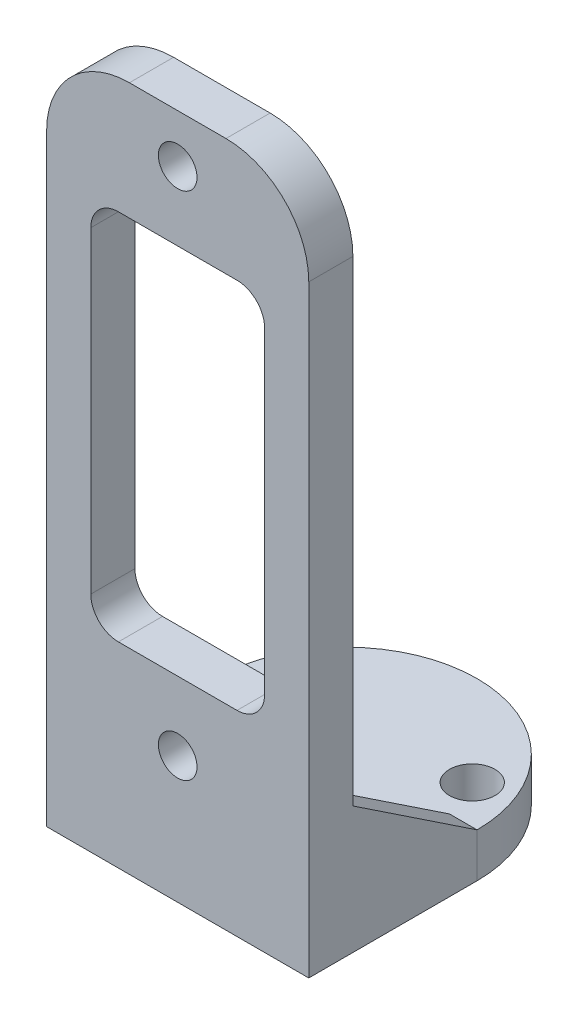
ISO-10303-21;
HEADER;
FILE_DESCRIPTION(('STEP AP214'),'2;1');
FILE_NAME('part.step','',(''),(''),'','','');
FILE_SCHEMA(('AUTOMOTIVE_DESIGN { 1 0 10303 214 1 1 1 1 }'));
ENDSEC;
DATA;
#1=APPLICATION_CONTEXT('core data for automotive mechanical design processes');
#2=APPLICATION_PROTOCOL_DEFINITION('international standard','automotive_design',2000,#1);
#3=PRODUCT_CONTEXT('',#1,'mechanical');
#4=PRODUCT('Part','Part','',(#3));
#5=PRODUCT_RELATED_PRODUCT_CATEGORY('part','',(#4));
#6=PRODUCT_DEFINITION_FORMATION('','',#4);
#7=PRODUCT_DEFINITION_CONTEXT('part definition',#1,'design');
#8=PRODUCT_DEFINITION('design','',#6,#7);
#9=PRODUCT_DEFINITION_SHAPE('','',#8);
#10=(LENGTH_UNIT() NAMED_UNIT(*) SI_UNIT(.MILLI.,.METRE.));
#11=(NAMED_UNIT(*) PLANE_ANGLE_UNIT() SI_UNIT($,.RADIAN.));
#12=(NAMED_UNIT(*) SI_UNIT($,.STERADIAN.) SOLID_ANGLE_UNIT());
#13=UNCERTAINTY_MEASURE_WITH_UNIT(LENGTH_MEASURE(1.E-05),#10,'distance_accuracy_value','');
#14=(GEOMETRIC_REPRESENTATION_CONTEXT(3) GLOBAL_UNCERTAINTY_ASSIGNED_CONTEXT((#13)) GLOBAL_UNIT_ASSIGNED_CONTEXT((#10,
#11,#12)) REPRESENTATION_CONTEXT('',''));
#15=CARTESIAN_POINT('',(0.,0.,0.));
#16=DIRECTION('',(0.,0.,1.));
#17=DIRECTION('',(1.,0.,0.));
#18=AXIS2_PLACEMENT_3D('',#15,#16,#17);
#19=CARTESIAN_POINT('',(6.,40.5,0.));
#20=DIRECTION('',(0.,0.,-1.));
#21=DIRECTION('',(-1.,0.,0.));
#22=AXIS2_PLACEMENT_3D('',#19,#20,#21);
#23=PLANE('',#22);
#24=CARTESIAN_POINT('',(9.5,6.,0.));
#25=DIRECTION('',(0.,0.,1.));
#26=DIRECTION('',(1.,0.,0.));
#27=AXIS2_PLACEMENT_3D('',#24,#25,#26);
#28=CIRCLE('',#27,1.4);
#29=CARTESIAN_POINT('',(10.9,6.,0.));
#30=VERTEX_POINT('',#29);
#31=EDGE_CURVE('E292',#30,#30,#28,.T.);
#32=ORIENTED_EDGE('',*,*,#31,.T.);
#33=EDGE_LOOP('',(#32));
#34=FACE_BOUND('',#33,.T.);
#35=CARTESIAN_POINT('',(9.5,43.,0.));
#36=DIRECTION('',(0.,0.,1.));
#37=DIRECTION('',(1.,0.,0.));
#38=AXIS2_PLACEMENT_3D('',#35,#36,#37);
#39=CIRCLE('',#38,1.4);
#40=CARTESIAN_POINT('',(10.9,43.,0.));
#41=VERTEX_POINT('',#40);
#42=EDGE_CURVE('E287',#41,#41,#39,.T.);
#43=ORIENTED_EDGE('',*,*,#42,.T.);
#44=EDGE_LOOP('',(#43));
#45=FACE_BOUND('',#44,.T.);
#46=DIRECTION('',(0.,1.,0.));
#47=VECTOR('',#46,1.);
#48=CARTESIAN_POINT('',(19.,0.,0.));
#49=LINE('',#48,#47);
#50=CARTESIAN_POINT('',(19.,6.,0.));
#51=VERTEX_POINT('',#50);
#52=CARTESIAN_POINT('',(19.,40.5,0.));
#53=VERTEX_POINT('',#52);
#54=EDGE_CURVE('E39',#51,#53,#49,.T.);
#55=ORIENTED_EDGE('',*,*,#54,.F.);
#56=DIRECTION('',(-1.,0.,0.));
#57=VECTOR('',#56,1.);
#58=CARTESIAN_POINT('',(19.,6.,0.));
#59=LINE('',#58,#57);
#60=CARTESIAN_POINT('',(17.,6.,0.));
#61=VERTEX_POINT('',#60);
#62=EDGE_CURVE('E240',#51,#61,#59,.T.);
#63=ORIENTED_EDGE('',*,*,#62,.T.);
#64=DIRECTION('',(0.,-1.,0.));
#65=VECTOR('',#64,1.);
#66=CARTESIAN_POINT('',(17.,6.,0.));
#67=LINE('',#66,#65);
#68=CARTESIAN_POINT('',(17.,0.,0.));
#69=VERTEX_POINT('',#68);
#70=EDGE_CURVE('E185',#61,#69,#67,.T.);
#71=ORIENTED_EDGE('',*,*,#70,.T.);
#72=DIRECTION('',(1.,0.,0.));
#73=VECTOR('',#72,1.);
#74=CARTESIAN_POINT('',(0.,0.,0.));
#75=LINE('',#74,#73);
#76=CARTESIAN_POINT('',(2.,0.,0.));
#77=VERTEX_POINT('',#76);
#78=EDGE_CURVE('E317',#77,#69,#75,.T.);
#79=ORIENTED_EDGE('',*,*,#78,.F.);
#80=DIRECTION('',(0.,-1.,0.));
#81=VECTOR('',#80,1.);
#82=CARTESIAN_POINT('',(2.,6.,0.));
#83=LINE('',#82,#81);
#84=CARTESIAN_POINT('',(2.,6.,0.));
#85=VERTEX_POINT('',#84);
#86=EDGE_CURVE('E252',#85,#77,#83,.T.);
#87=ORIENTED_EDGE('',*,*,#86,.F.);
#88=DIRECTION('',(-1.,0.,0.));
#89=VECTOR('',#88,1.);
#90=CARTESIAN_POINT('',(2.,6.,0.));
#91=LINE('',#90,#89);
#92=CARTESIAN_POINT('',(0.,6.,0.));
#93=VERTEX_POINT('',#92);
#94=EDGE_CURVE('E261',#85,#93,#91,.T.);
#95=ORIENTED_EDGE('',*,*,#94,.T.);
#96=DIRECTION('',(0.,-1.,0.));
#97=VECTOR('',#96,1.);
#98=CARTESIAN_POINT('',(0.,0.,0.));
#99=LINE('',#98,#97);
#100=CARTESIAN_POINT('',(0.,40.5,0.));
#101=VERTEX_POINT('',#100);
#102=EDGE_CURVE('E298',#101,#93,#99,.T.);
#103=ORIENTED_EDGE('',*,*,#102,.F.);
#104=CARTESIAN_POINT('',(6.,40.5,0.));
#105=DIRECTION('',(0.,0.,1.));
#106=DIRECTION('',(-1.,0.,0.));
#107=AXIS2_PLACEMENT_3D('',#104,#105,#106);
#108=CIRCLE('',#107,6.);
#109=CARTESIAN_POINT('',(6.,46.5,0.));
#110=VERTEX_POINT('',#109);
#111=EDGE_CURVE('E304',#110,#101,#108,.T.);
#112=ORIENTED_EDGE('',*,*,#111,.F.);
#113=DIRECTION('',(-1.,0.,0.));
#114=VECTOR('',#113,1.);
#115=CARTESIAN_POINT('',(6.,46.5,0.));
#116=LINE('',#115,#114);
#117=CARTESIAN_POINT('',(13.,46.5,0.));
#118=VERTEX_POINT('',#117);
#119=EDGE_CURVE('E332',#118,#110,#116,.T.);
#120=ORIENTED_EDGE('',*,*,#119,.F.);
#121=CARTESIAN_POINT('',(13.,40.5,0.));
#122=DIRECTION('',(0.,0.,1.));
#123=DIRECTION('',(-1.,0.,0.));
#124=AXIS2_PLACEMENT_3D('',#121,#122,#123);
#125=CIRCLE('',#124,6.);
#126=EDGE_CURVE('E315',#53,#118,#125,.T.);
#127=ORIENTED_EDGE('',*,*,#126,.F.);
#128=EDGE_LOOP('',(#55,#63,#71,#79,#87,#95,#103,#112,#120,#127));
#129=FACE_BOUND('',#128,.T.);
#130=DIRECTION('',(0.,-1.,0.));
#131=VECTOR('',#130,1.);
#132=CARTESIAN_POINT('',(3.2,36.,0.));
#133=LINE('',#132,#131);
#134=CARTESIAN_POINT('',(3.2,36.,0.));
#135=VERTEX_POINT('',#134);
#136=CARTESIAN_POINT('',(3.2,13.,0.));
#137=VERTEX_POINT('',#136);
#138=EDGE_CURVE('E178',#135,#137,#133,.T.);
#139=ORIENTED_EDGE('',*,*,#138,.T.);
#140=CARTESIAN_POINT('',(5.2,13.,0.));
#141=DIRECTION('',(0.,0.,1.));
#142=DIRECTION('',(1.,0.,0.));
#143=AXIS2_PLACEMENT_3D('',#140,#141,#142);
#144=CIRCLE('',#143,2.);
#145=CARTESIAN_POINT('',(5.2,11.,0.));
#146=VERTEX_POINT('',#145);
#147=EDGE_CURVE('E53',#137,#146,#144,.T.);
#148=ORIENTED_EDGE('',*,*,#147,.T.);
#149=DIRECTION('',(1.,0.,0.));
#150=VECTOR('',#149,1.);
#151=CARTESIAN_POINT('',(5.2,11.,0.));
#152=LINE('',#151,#150);
#153=CARTESIAN_POINT('',(13.8,11.,0.));
#154=VERTEX_POINT('',#153);
#155=EDGE_CURVE('E184',#146,#154,#152,.T.);
#156=ORIENTED_EDGE('',*,*,#155,.T.);
#157=CARTESIAN_POINT('',(13.8,13.,0.));
#158=DIRECTION('',(0.,0.,1.));
#159=DIRECTION('',(1.,0.,0.));
#160=AXIS2_PLACEMENT_3D('',#157,#158,#159);
#161=CIRCLE('',#160,2.);
#162=CARTESIAN_POINT('',(15.8,13.,0.));
#163=VERTEX_POINT('',#162);
#164=EDGE_CURVE('E209',#154,#163,#161,.T.);
#165=ORIENTED_EDGE('',*,*,#164,.T.);
#166=DIRECTION('',(0.,1.,0.));
#167=VECTOR('',#166,1.);
#168=CARTESIAN_POINT('',(15.8,36.,0.));
#169=LINE('',#168,#167);
#170=CARTESIAN_POINT('',(15.8,36.,0.));
#171=VERTEX_POINT('',#170);
#172=EDGE_CURVE('E212',#163,#171,#169,.T.);
#173=ORIENTED_EDGE('',*,*,#172,.T.);
#174=CARTESIAN_POINT('',(13.8,36.,0.));
#175=DIRECTION('',(0.,0.,1.));
#176=DIRECTION('',(-1.,0.,0.));
#177=AXIS2_PLACEMENT_3D('',#174,#175,#176);
#178=CIRCLE('',#177,2.);
#179=CARTESIAN_POINT('',(13.8,38.,0.));
#180=VERTEX_POINT('',#179);
#181=EDGE_CURVE('E215',#171,#180,#178,.T.);
#182=ORIENTED_EDGE('',*,*,#181,.T.);
#183=DIRECTION('',(-1.,0.,0.));
#184=VECTOR('',#183,1.);
#185=CARTESIAN_POINT('',(5.2,38.,0.));
#186=LINE('',#185,#184);
#187=CARTESIAN_POINT('',(5.2,38.,0.));
#188=VERTEX_POINT('',#187);
#189=EDGE_CURVE('E218',#180,#188,#186,.T.);
#190=ORIENTED_EDGE('',*,*,#189,.T.);
#191=CARTESIAN_POINT('',(5.2,36.,0.));
#192=DIRECTION('',(0.,0.,1.));
#193=DIRECTION('',(1.,0.,0.));
#194=AXIS2_PLACEMENT_3D('',#191,#192,#193);
#195=CIRCLE('',#194,2.);
#196=EDGE_CURVE('E221',#188,#135,#195,.T.);
#197=ORIENTED_EDGE('',*,*,#196,.T.);
#198=EDGE_LOOP('',(#139,#148,#156,#165,#173,#182,#190,#197));
#199=FACE_BOUND('',#198,.T.);
#200=ADVANCED_FACE('F35',(#34,#45,#129,#199),#23,.T.);
#201=CARTESIAN_POINT('',(6.,40.5,3.2));
#202=DIRECTION('',(0.,0.,-1.));
#203=DIRECTION('',(-1.,0.,0.));
#204=AXIS2_PLACEMENT_3D('',#201,#202,#203);
#205=PLANE('',#204);
#206=CARTESIAN_POINT('',(9.5,43.,3.2));
#207=DIRECTION('',(0.,0.,1.));
#208=DIRECTION('',(1.,0.,0.));
#209=AXIS2_PLACEMENT_3D('',#206,#207,#208);
#210=CIRCLE('',#209,1.4);
#211=CARTESIAN_POINT('',(10.9,43.,3.2));
#212=VERTEX_POINT('',#211);
#213=EDGE_CURVE('E289',#212,#212,#210,.T.);
#214=ORIENTED_EDGE('',*,*,#213,.F.);
#215=EDGE_LOOP('',(#214));
#216=FACE_BOUND('',#215,.T.);
#217=CARTESIAN_POINT('',(9.5,6.,3.2));
#218=DIRECTION('',(0.,0.,1.));
#219=DIRECTION('',(1.,0.,0.));
#220=AXIS2_PLACEMENT_3D('',#217,#218,#219);
#221=CIRCLE('',#220,1.4);
#222=CARTESIAN_POINT('',(10.9,6.,3.2));
#223=VERTEX_POINT('',#222);
#224=EDGE_CURVE('E295',#223,#223,#221,.T.);
#225=ORIENTED_EDGE('',*,*,#224,.F.);
#226=EDGE_LOOP('',(#225));
#227=FACE_BOUND('',#226,.T.);
#228=DIRECTION('',(0.,-1.,0.));
#229=VECTOR('',#228,1.);
#230=CARTESIAN_POINT('',(0.,0.,3.2));
#231=LINE('',#230,#229);
#232=CARTESIAN_POINT('',(0.,40.5,3.2));
#233=VERTEX_POINT('',#232);
#234=CARTESIAN_POINT('',(0.,-3.2,3.2));
#235=VERTEX_POINT('',#234);
#236=EDGE_CURVE('E301',#233,#235,#231,.T.);
#237=ORIENTED_EDGE('',*,*,#236,.T.);
#238=DIRECTION('',(1.,0.,0.));
#239=VECTOR('',#238,1.);
#240=CARTESIAN_POINT('',(0.,-3.2,3.2));
#241=LINE('',#240,#239);
#242=CARTESIAN_POINT('',(19.,-3.2,3.2));
#243=VERTEX_POINT('',#242);
#244=EDGE_CURVE('E275',#235,#243,#241,.T.);
#245=ORIENTED_EDGE('',*,*,#244,.T.);
#246=DIRECTION('',(0.,1.,0.));
#247=VECTOR('',#246,1.);
#248=CARTESIAN_POINT('',(19.,0.,3.2));
#249=LINE('',#248,#247);
#250=CARTESIAN_POINT('',(19.,40.5,3.2));
#251=VERTEX_POINT('',#250);
#252=EDGE_CURVE('E303',#243,#251,#249,.T.);
#253=ORIENTED_EDGE('',*,*,#252,.T.);
#254=CARTESIAN_POINT('',(13.,40.5,3.2));
#255=DIRECTION('',(0.,0.,1.));
#256=DIRECTION('',(-1.,0.,0.));
#257=AXIS2_PLACEMENT_3D('',#254,#255,#256);
#258=CIRCLE('',#257,6.);
#259=CARTESIAN_POINT('',(13.,46.5,3.2));
#260=VERTEX_POINT('',#259);
#261=EDGE_CURVE('E306',#251,#260,#258,.T.);
#262=ORIENTED_EDGE('',*,*,#261,.T.);
#263=DIRECTION('',(-1.,0.,0.));
#264=VECTOR('',#263,1.);
#265=CARTESIAN_POINT('',(6.,46.5,3.2));
#266=LINE('',#265,#264);
#267=CARTESIAN_POINT('',(6.,46.5,3.2));
#268=VERTEX_POINT('',#267);
#269=EDGE_CURVE('E308',#260,#268,#266,.T.);
#270=ORIENTED_EDGE('',*,*,#269,.T.);
#271=CARTESIAN_POINT('',(6.,40.5,3.2));
#272=DIRECTION('',(0.,0.,1.));
#273=DIRECTION('',(-1.,0.,0.));
#274=AXIS2_PLACEMENT_3D('',#271,#272,#273);
#275=CIRCLE('',#274,6.);
#276=EDGE_CURVE('E310',#268,#233,#275,.T.);
#277=ORIENTED_EDGE('',*,*,#276,.T.);
#278=EDGE_LOOP('',(#237,#245,#253,#262,#270,#277));
#279=FACE_BOUND('',#278,.T.);
#280=CARTESIAN_POINT('',(5.2,13.,3.2));
#281=DIRECTION('',(0.,0.,1.));
#282=DIRECTION('',(1.,0.,0.));
#283=AXIS2_PLACEMENT_3D('',#280,#281,#282);
#284=CIRCLE('',#283,2.);
#285=CARTESIAN_POINT('',(3.2,13.,3.2));
#286=VERTEX_POINT('',#285);
#287=CARTESIAN_POINT('',(5.2,11.,3.2));
#288=VERTEX_POINT('',#287);
#289=EDGE_CURVE('E169',#286,#288,#284,.T.);
#290=ORIENTED_EDGE('',*,*,#289,.F.);
#291=DIRECTION('',(0.,-1.,0.));
#292=VECTOR('',#291,1.);
#293=CARTESIAN_POINT('',(3.2,36.,3.2));
#294=LINE('',#293,#292);
#295=CARTESIAN_POINT('',(3.2,36.,3.2));
#296=VERTEX_POINT('',#295);
#297=EDGE_CURVE('E204',#296,#286,#294,.T.);
#298=ORIENTED_EDGE('',*,*,#297,.F.);
#299=CARTESIAN_POINT('',(5.2,36.,3.2));
#300=DIRECTION('',(0.,0.,1.));
#301=DIRECTION('',(1.,0.,0.));
#302=AXIS2_PLACEMENT_3D('',#299,#300,#301);
#303=CIRCLE('',#302,2.);
#304=CARTESIAN_POINT('',(5.2,38.,3.2));
#305=VERTEX_POINT('',#304);
#306=EDGE_CURVE('E202',#305,#296,#303,.T.);
#307=ORIENTED_EDGE('',*,*,#306,.F.);
#308=DIRECTION('',(-1.,0.,0.));
#309=VECTOR('',#308,1.);
#310=CARTESIAN_POINT('',(5.2,38.,3.2));
#311=LINE('',#310,#309);
#312=CARTESIAN_POINT('',(13.8,38.,3.2));
#313=VERTEX_POINT('',#312);
#314=EDGE_CURVE('E200',#313,#305,#311,.T.);
#315=ORIENTED_EDGE('',*,*,#314,.F.);
#316=CARTESIAN_POINT('',(13.8,36.,3.2));
#317=DIRECTION('',(0.,0.,1.));
#318=DIRECTION('',(-1.,0.,0.));
#319=AXIS2_PLACEMENT_3D('',#316,#317,#318);
#320=CIRCLE('',#319,2.);
#321=CARTESIAN_POINT('',(15.8,36.,3.2));
#322=VERTEX_POINT('',#321);
#323=EDGE_CURVE('E198',#322,#313,#320,.T.);
#324=ORIENTED_EDGE('',*,*,#323,.F.);
#325=DIRECTION('',(0.,1.,0.));
#326=VECTOR('',#325,1.);
#327=CARTESIAN_POINT('',(15.8,36.,3.2));
#328=LINE('',#327,#326);
#329=CARTESIAN_POINT('',(15.8,13.,3.2));
#330=VERTEX_POINT('',#329);
#331=EDGE_CURVE('E193',#330,#322,#328,.T.);
#332=ORIENTED_EDGE('',*,*,#331,.F.);
#333=CARTESIAN_POINT('',(13.8,13.,3.2));
#334=DIRECTION('',(0.,0.,1.));
#335=DIRECTION('',(1.,0.,0.));
#336=AXIS2_PLACEMENT_3D('',#333,#334,#335);
#337=CIRCLE('',#336,2.);
#338=CARTESIAN_POINT('',(13.8,11.,3.2));
#339=VERTEX_POINT('',#338);
#340=EDGE_CURVE('E191',#339,#330,#337,.T.);
#341=ORIENTED_EDGE('',*,*,#340,.F.);
#342=DIRECTION('',(1.,0.,0.));
#343=VECTOR('',#342,1.);
#344=CARTESIAN_POINT('',(5.2,11.,3.2));
#345=LINE('',#344,#343);
#346=EDGE_CURVE('E177',#288,#339,#345,.T.);
#347=ORIENTED_EDGE('',*,*,#346,.F.);
#348=EDGE_LOOP('',(#290,#298,#307,#315,#324,#332,#341,#347));
#349=FACE_BOUND('',#348,.T.);
#350=ADVANCED_FACE('F189',(#216,#227,#279,#349),#205,.F.);
#351=CARTESIAN_POINT('',(9.5,0.,-9.));
#352=DIRECTION('',(0.,1.,0.));
#353=DIRECTION('',(0.,0.,1.));
#354=AXIS2_PLACEMENT_3D('',#351,#352,#353);
#355=PLANE('',#354);
#356=CARTESIAN_POINT('',(15.85,0.,-11.8));
#357=DIRECTION('',(0.,1.,0.));
#358=DIRECTION('',(0.,0.,1.));
#359=AXIS2_PLACEMENT_3D('',#356,#357,#358);
#360=CIRCLE('',#359,1.65);
#361=CARTESIAN_POINT('',(15.85,0.,-10.15));
#362=VERTEX_POINT('',#361);
#363=EDGE_CURVE('E467',#362,#362,#360,.T.);
#364=ORIENTED_EDGE('',*,*,#363,.F.);
#365=EDGE_LOOP('',(#364));
#366=FACE_BOUND('',#365,.T.);
#367=CARTESIAN_POINT('',(14.14852263,0.,-5.45));
#368=DIRECTION('',(0.,1.,0.));
#369=DIRECTION('',(0.,0.,1.));
#370=AXIS2_PLACEMENT_3D('',#367,#368,#369);
#371=CIRCLE('',#370,1.65000000000001);
#372=CARTESIAN_POINT('',(14.14852263,0.,-3.79999999999999));
#373=VERTEX_POINT('',#372);
#374=EDGE_CURVE('E475',#373,#373,#371,.T.);
#375=ORIENTED_EDGE('',*,*,#374,.F.);
#376=EDGE_LOOP('',(#375));
#377=FACE_BOUND('',#376,.T.);
#378=CARTESIAN_POINT('',(4.85147737000001,0.,-5.45));
#379=DIRECTION('',(0.,1.,0.));
#380=DIRECTION('',(0.,0.,1.));
#381=AXIS2_PLACEMENT_3D('',#378,#379,#380);
#382=CIRCLE('',#381,1.65);
#383=CARTESIAN_POINT('',(4.85147737000001,0.,-3.8));
#384=VERTEX_POINT('',#383);
#385=EDGE_CURVE('E471',#384,#384,#382,.T.);
#386=ORIENTED_EDGE('',*,*,#385,.F.);
#387=EDGE_LOOP('',(#386));
#388=FACE_BOUND('',#387,.T.);
#389=CARTESIAN_POINT('',(3.15,0.,-11.8));
#390=DIRECTION('',(0.,1.,0.));
#391=DIRECTION('',(0.,0.,1.));
#392=AXIS2_PLACEMENT_3D('',#389,#390,#391);
#393=CIRCLE('',#392,1.65);
#394=CARTESIAN_POINT('',(3.15,0.,-10.15));
#395=VERTEX_POINT('',#394);
#396=EDGE_CURVE('E207',#395,#395,#393,.T.);
#397=ORIENTED_EDGE('',*,*,#396,.F.);
#398=EDGE_LOOP('',(#397));
#399=FACE_BOUND('',#398,.T.);
#400=DIRECTION('',(0.,0.,-1.));
#401=VECTOR('',#400,1.);
#402=CARTESIAN_POINT('',(17.,0.,0.));
#403=LINE('',#402,#401);
#404=CARTESIAN_POINT('',(17.,0.,-9.));
#405=VERTEX_POINT('',#404);
#406=EDGE_CURVE('E243',#69,#405,#403,.T.);
#407=ORIENTED_EDGE('',*,*,#406,.T.);
#408=DIRECTION('',(-1.,0.,0.));
#409=VECTOR('',#408,1.);
#410=CARTESIAN_POINT('',(19.,0.,-9.));
#411=LINE('',#410,#409);
#412=CARTESIAN_POINT('',(19.,0.,-9.));
#413=VERTEX_POINT('',#412);
#414=EDGE_CURVE('E248',#413,#405,#411,.T.);
#415=ORIENTED_EDGE('',*,*,#414,.F.);
#416=CARTESIAN_POINT('',(9.5,0.,-9.));
#417=DIRECTION('',(0.,1.,0.));
#418=DIRECTION('',(0.,0.,1.));
#419=AXIS2_PLACEMENT_3D('',#416,#417,#418);
#420=CIRCLE('',#419,9.5);
#421=CARTESIAN_POINT('',(0.,0.,-9.));
#422=VERTEX_POINT('',#421);
#423=EDGE_CURVE('E268',#413,#422,#420,.T.);
#424=ORIENTED_EDGE('',*,*,#423,.T.);
#425=DIRECTION('',(-1.,0.,0.));
#426=VECTOR('',#425,1.);
#427=CARTESIAN_POINT('',(2.,0.,-9.));
#428=LINE('',#427,#426);
#429=CARTESIAN_POINT('',(2.,0.,-9.));
#430=VERTEX_POINT('',#429);
#431=EDGE_CURVE('E265',#430,#422,#428,.T.);
#432=ORIENTED_EDGE('',*,*,#431,.F.);
#433=DIRECTION('',(0.,0.,-1.));
#434=VECTOR('',#433,1.);
#435=CARTESIAN_POINT('',(2.,0.,0.));
#436=LINE('',#435,#434);
#437=EDGE_CURVE('E255',#77,#430,#436,.T.);
#438=ORIENTED_EDGE('',*,*,#437,.F.);
#439=ORIENTED_EDGE('',*,*,#78,.T.);
#440=EDGE_LOOP('',(#407,#415,#424,#432,#438,#439));
#441=FACE_BOUND('',#440,.T.);
#442=ADVANCED_FACE('F382',(#366,#377,#388,#399,#441),#355,.T.);
#443=CARTESIAN_POINT('',(0.,0.,3.2));
#444=DIRECTION('',(1.,0.,0.));
#445=DIRECTION('',(0.,0.,-1.));
#446=AXIS2_PLACEMENT_3D('',#443,#444,#445);
#447=PLANE('',#446);
#448=ORIENTED_EDGE('',*,*,#102,.T.);
#449=DIRECTION('',(0.,0.554700196225229,0.832050294337844));
#450=VECTOR('',#449,1.);
#451=CARTESIAN_POINT('',(0.,0.,-9.));
#452=LINE('',#451,#450);
#453=EDGE_CURVE('E251',#422,#93,#452,.T.);
#454=ORIENTED_EDGE('',*,*,#453,.F.);
#455=DIRECTION('',(0.,1.,0.));
#456=VECTOR('',#455,1.);
#457=CARTESIAN_POINT('',(0.,-3.2,-9.));
#458=LINE('',#457,#456);
#459=CARTESIAN_POINT('',(0.,-3.2,-9.));
#460=VERTEX_POINT('',#459);
#461=EDGE_CURVE('E281',#460,#422,#458,.T.);
#462=ORIENTED_EDGE('',*,*,#461,.F.);
#463=DIRECTION('',(0.,0.,1.));
#464=VECTOR('',#463,1.);
#465=CARTESIAN_POINT('',(0.,-3.2,-9.));
#466=LINE('',#465,#464);
#467=EDGE_CURVE('E272',#460,#235,#466,.T.);
#468=ORIENTED_EDGE('',*,*,#467,.T.);
#469=ORIENTED_EDGE('',*,*,#236,.F.);
#470=DIRECTION('',(0.,0.,-1.));
#471=VECTOR('',#470,1.);
#472=CARTESIAN_POINT('',(0.,40.5,3.2));
#473=LINE('',#472,#471);
#474=EDGE_CURVE('E312',#233,#101,#473,.T.);
#475=ORIENTED_EDGE('',*,*,#474,.T.);
#476=EDGE_LOOP('',(#448,#454,#462,#468,#469,#475));
#477=FACE_BOUND('',#476,.T.);
#478=ADVANCED_FACE('F37',(#477),#447,.F.);
#479=CARTESIAN_POINT('',(19.,0.,3.2));
#480=DIRECTION('',(-1.,0.,0.));
#481=DIRECTION('',(0.,0.,1.));
#482=AXIS2_PLACEMENT_3D('',#479,#480,#481);
#483=PLANE('',#482);
#484=DIRECTION('',(0.,0.554700196225229,0.832050294337844));
#485=VECTOR('',#484,1.);
#486=CARTESIAN_POINT('',(19.,0.,-9.));
#487=LINE('',#486,#485);
#488=EDGE_CURVE('E237',#413,#51,#487,.T.);
#489=ORIENTED_EDGE('',*,*,#488,.T.);
#490=ORIENTED_EDGE('',*,*,#54,.T.);
#491=DIRECTION('',(0.,0.,-1.));
#492=VECTOR('',#491,1.);
#493=CARTESIAN_POINT('',(19.,40.5,3.2));
#494=LINE('',#493,#492);
#495=EDGE_CURVE('E11',#251,#53,#494,.T.);
#496=ORIENTED_EDGE('',*,*,#495,.F.);
#497=ORIENTED_EDGE('',*,*,#252,.F.);
#498=DIRECTION('',(0.,0.,-1.));
#499=VECTOR('',#498,1.);
#500=CARTESIAN_POINT('',(19.,-3.2,3.2));
#501=LINE('',#500,#499);
#502=CARTESIAN_POINT('',(19.,-3.2,-9.));
#503=VERTEX_POINT('',#502);
#504=EDGE_CURVE('E278',#243,#503,#501,.T.);
#505=ORIENTED_EDGE('',*,*,#504,.T.);
#506=DIRECTION('',(0.,1.,0.));
#507=VECTOR('',#506,1.);
#508=CARTESIAN_POINT('',(19.,-3.2,-9.));
#509=LINE('',#508,#507);
#510=EDGE_CURVE('E284',#503,#413,#509,.T.);
#511=ORIENTED_EDGE('',*,*,#510,.T.);
#512=EDGE_LOOP('',(#489,#490,#496,#497,#505,#511));
#513=FACE_BOUND('',#512,.T.);
#514=ADVANCED_FACE('F341',(#513),#483,.F.);
#515=CARTESIAN_POINT('',(13.,40.5,3.2));
#516=DIRECTION('',(0.,0.,-1.));
#517=DIRECTION('',(-1.,0.,0.));
#518=AXIS2_PLACEMENT_3D('',#515,#516,#517);
#519=CYLINDRICAL_SURFACE('',#518,6.);
#520=ORIENTED_EDGE('',*,*,#126,.T.);
#521=DIRECTION('',(0.,0.,-1.));
#522=VECTOR('',#521,1.);
#523=CARTESIAN_POINT('',(13.,46.5,3.2));
#524=LINE('',#523,#522);
#525=EDGE_CURVE('E45',#260,#118,#524,.T.);
#526=ORIENTED_EDGE('',*,*,#525,.F.);
#527=ORIENTED_EDGE('',*,*,#261,.F.);
#528=ORIENTED_EDGE('',*,*,#495,.T.);
#529=EDGE_LOOP('',(#520,#526,#527,#528));
#530=FACE_BOUND('',#529,.T.);
#531=ADVANCED_FACE('F346',(#530),#519,.T.);
#532=CARTESIAN_POINT('',(6.,46.5,3.2));
#533=DIRECTION('',(0.,-1.,0.));
#534=DIRECTION('',(0.,0.,-1.));
#535=AXIS2_PLACEMENT_3D('',#532,#533,#534);
#536=PLANE('',#535);
#537=ORIENTED_EDGE('',*,*,#119,.T.);
#538=DIRECTION('',(0.,0.,-1.));
#539=VECTOR('',#538,1.);
#540=CARTESIAN_POINT('',(6.,46.5,3.2));
#541=LINE('',#540,#539);
#542=EDGE_CURVE('E327',#268,#110,#541,.T.);
#543=ORIENTED_EDGE('',*,*,#542,.F.);
#544=ORIENTED_EDGE('',*,*,#269,.F.);
#545=ORIENTED_EDGE('',*,*,#525,.T.);
#546=EDGE_LOOP('',(#537,#543,#544,#545));
#547=FACE_BOUND('',#546,.T.);
#548=ADVANCED_FACE('F366',(#547),#536,.F.);
#549=CARTESIAN_POINT('',(6.,40.5,3.2));
#550=DIRECTION('',(0.,0.,-1.));
#551=DIRECTION('',(-1.,0.,0.));
#552=AXIS2_PLACEMENT_3D('',#549,#550,#551);
#553=CYLINDRICAL_SURFACE('',#552,6.);
#554=ORIENTED_EDGE('',*,*,#111,.T.);
#555=ORIENTED_EDGE('',*,*,#474,.F.);
#556=ORIENTED_EDGE('',*,*,#276,.F.);
#557=ORIENTED_EDGE('',*,*,#542,.T.);
#558=EDGE_LOOP('',(#554,#555,#556,#557));
#559=FACE_BOUND('',#558,.T.);
#560=ADVANCED_FACE('F352',(#559),#553,.T.);
#561=CARTESIAN_POINT('',(9.5,6.,3.2));
#562=DIRECTION('',(0.,0.,-1.));
#563=DIRECTION('',(-1.,0.,0.));
#564=AXIS2_PLACEMENT_3D('',#561,#562,#563);
#565=CYLINDRICAL_SURFACE('',#564,1.4);
#566=ORIENTED_EDGE('',*,*,#224,.T.);
#567=EDGE_LOOP('',(#566));
#568=FACE_BOUND('',#567,.T.);
#569=ORIENTED_EDGE('',*,*,#31,.F.);
#570=EDGE_LOOP('',(#569));
#571=FACE_BOUND('',#570,.T.);
#572=ADVANCED_FACE('F373',(#568,#571),#565,.F.);
#573=CARTESIAN_POINT('',(9.5,43.,3.2));
#574=DIRECTION('',(0.,0.,-1.));
#575=DIRECTION('',(-1.,0.,0.));
#576=AXIS2_PLACEMENT_3D('',#573,#574,#575);
#577=CYLINDRICAL_SURFACE('',#576,1.4);
#578=ORIENTED_EDGE('',*,*,#213,.T.);
#579=EDGE_LOOP('',(#578));
#580=FACE_BOUND('',#579,.T.);
#581=ORIENTED_EDGE('',*,*,#42,.F.);
#582=EDGE_LOOP('',(#581));
#583=FACE_BOUND('',#582,.T.);
#584=ADVANCED_FACE('F389',(#580,#583),#577,.F.);
#585=CARTESIAN_POINT('',(9.5,-3.2,-9.));
#586=DIRECTION('',(0.,1.,0.));
#587=DIRECTION('',(0.,0.,1.));
#588=AXIS2_PLACEMENT_3D('',#585,#586,#587);
#589=CYLINDRICAL_SURFACE('',#588,9.5);
#590=ORIENTED_EDGE('',*,*,#423,.F.);
#591=ORIENTED_EDGE('',*,*,#510,.F.);
#592=CARTESIAN_POINT('',(9.5,-3.2,-9.));
#593=DIRECTION('',(0.,1.,0.));
#594=DIRECTION('',(0.,0.,1.));
#595=AXIS2_PLACEMENT_3D('',#592,#593,#594);
#596=CIRCLE('',#595,9.5);
#597=EDGE_CURVE('E269',#503,#460,#596,.T.);
#598=ORIENTED_EDGE('',*,*,#597,.T.);
#599=ORIENTED_EDGE('',*,*,#461,.T.);
#600=EDGE_LOOP('',(#590,#591,#598,#599));
#601=FACE_BOUND('',#600,.T.);
#602=ADVANCED_FACE('F393',(#601),#589,.T.);
#603=CARTESIAN_POINT('',(9.5,-3.2,-9.));
#604=DIRECTION('',(0.,1.,0.));
#605=DIRECTION('',(0.,0.,1.));
#606=AXIS2_PLACEMENT_3D('',#603,#604,#605);
#607=PLANE('',#606);
#608=CARTESIAN_POINT('',(15.85,-3.2,-11.8));
#609=DIRECTION('',(0.,1.,0.));
#610=DIRECTION('',(0.,0.,-1.));
#611=AXIS2_PLACEMENT_3D('',#608,#609,#610);
#612=CIRCLE('',#611,1.65);
#613=CARTESIAN_POINT('',(15.85,-3.2,-13.45));
#614=VERTEX_POINT('',#613);
#615=EDGE_CURVE('E470',#614,#614,#612,.T.);
#616=ORIENTED_EDGE('',*,*,#615,.T.);
#617=EDGE_LOOP('',(#616));
#618=FACE_BOUND('',#617,.T.);
#619=CARTESIAN_POINT('',(14.14852263,-3.2,-5.45));
#620=DIRECTION('',(0.,1.,0.));
#621=DIRECTION('',(0.,0.,1.));
#622=AXIS2_PLACEMENT_3D('',#619,#620,#621);
#623=CIRCLE('',#622,1.65000000000001);
#624=CARTESIAN_POINT('',(14.14852263,-3.2,-3.79999999999999));
#625=VERTEX_POINT('',#624);
#626=EDGE_CURVE('E472',#625,#625,#623,.T.);
#627=ORIENTED_EDGE('',*,*,#626,.T.);
#628=EDGE_LOOP('',(#627));
#629=FACE_BOUND('',#628,.T.);
#630=CARTESIAN_POINT('',(4.85147737000001,-3.2,-5.45));
#631=DIRECTION('',(0.,1.,0.));
#632=DIRECTION('',(0.,0.,1.));
#633=AXIS2_PLACEMENT_3D('',#630,#631,#632);
#634=CIRCLE('',#633,1.65);
#635=CARTESIAN_POINT('',(4.85147737000001,-3.2,-3.8));
#636=VERTEX_POINT('',#635);
#637=EDGE_CURVE('E478',#636,#636,#634,.T.);
#638=ORIENTED_EDGE('',*,*,#637,.T.);
#639=EDGE_LOOP('',(#638));
#640=FACE_BOUND('',#639,.T.);
#641=CARTESIAN_POINT('',(3.15,-3.2,-11.8));
#642=DIRECTION('',(0.,1.,0.));
#643=DIRECTION('',(0.,0.,1.));
#644=AXIS2_PLACEMENT_3D('',#641,#642,#643);
#645=CIRCLE('',#644,1.65);
#646=CARTESIAN_POINT('',(3.15,-3.2,-10.15));
#647=VERTEX_POINT('',#646);
#648=EDGE_CURVE('E486',#647,#647,#645,.T.);
#649=ORIENTED_EDGE('',*,*,#648,.T.);
#650=EDGE_LOOP('',(#649));
#651=FACE_BOUND('',#650,.T.);
#652=ORIENTED_EDGE('',*,*,#597,.F.);
#653=ORIENTED_EDGE('',*,*,#504,.F.);
#654=ORIENTED_EDGE('',*,*,#244,.F.);
#655=ORIENTED_EDGE('',*,*,#467,.F.);
#656=EDGE_LOOP('',(#652,#653,#654,#655));
#657=FACE_BOUND('',#656,.T.);
#658=ADVANCED_FACE('F363',(#618,#629,#640,#651,#657),#607,.F.);
#659=CARTESIAN_POINT('',(2.,0.,-9.));
#660=DIRECTION('',(0.,-0.832050294337844,0.554700196225229));
#661=DIRECTION('',(0.,-0.554700196225229,-0.832050294337844));
#662=AXIS2_PLACEMENT_3D('',#659,#660,#661);
#663=PLANE('',#662);
#664=ORIENTED_EDGE('',*,*,#453,.T.);
#665=ORIENTED_EDGE('',*,*,#94,.F.);
#666=DIRECTION('',(0.,0.554700196225229,0.832050294337844));
#667=VECTOR('',#666,1.);
#668=CARTESIAN_POINT('',(2.,0.,-9.));
#669=LINE('',#668,#667);
#670=EDGE_CURVE('E258',#430,#85,#669,.T.);
#671=ORIENTED_EDGE('',*,*,#670,.F.);
#672=ORIENTED_EDGE('',*,*,#431,.T.);
#673=EDGE_LOOP('',(#664,#665,#671,#672));
#674=FACE_BOUND('',#673,.T.);
#675=ADVANCED_FACE('F403',(#674),#663,.F.);
#676=CARTESIAN_POINT('',(2.,0.,0.));
#677=DIRECTION('',(1.,0.,0.));
#678=DIRECTION('',(0.,0.,-1.));
#679=AXIS2_PLACEMENT_3D('',#676,#677,#678);
#680=PLANE('',#679);
#681=ORIENTED_EDGE('',*,*,#86,.T.);
#682=ORIENTED_EDGE('',*,*,#437,.T.);
#683=ORIENTED_EDGE('',*,*,#670,.T.);
#684=EDGE_LOOP('',(#681,#682,#683));
#685=FACE_BOUND('',#684,.T.);
#686=ADVANCED_FACE('F407',(#685),#680,.T.);
#687=CARTESIAN_POINT('',(19.,0.,-9.));
#688=DIRECTION('',(0.,-0.832050294337844,0.554700196225229));
#689=DIRECTION('',(0.,-0.554700196225229,-0.832050294337844));
#690=AXIS2_PLACEMENT_3D('',#687,#688,#689);
#691=PLANE('',#690);
#692=DIRECTION('',(0.,0.554700196225229,0.832050294337844));
#693=VECTOR('',#692,1.);
#694=CARTESIAN_POINT('',(17.,0.,-9.));
#695=LINE('',#694,#693);
#696=EDGE_CURVE('E241',#405,#61,#695,.T.);
#697=ORIENTED_EDGE('',*,*,#696,.T.);
#698=ORIENTED_EDGE('',*,*,#62,.F.);
#699=ORIENTED_EDGE('',*,*,#488,.F.);
#700=ORIENTED_EDGE('',*,*,#414,.T.);
#701=EDGE_LOOP('',(#697,#698,#699,#700));
#702=FACE_BOUND('',#701,.T.);
#703=ADVANCED_FACE('F411',(#702),#691,.F.);
#704=CARTESIAN_POINT('',(17.,0.,0.));
#705=DIRECTION('',(1.,0.,0.));
#706=DIRECTION('',(0.,0.,-1.));
#707=AXIS2_PLACEMENT_3D('',#704,#705,#706);
#708=PLANE('',#707);
#709=ORIENTED_EDGE('',*,*,#70,.F.);
#710=ORIENTED_EDGE('',*,*,#696,.F.);
#711=ORIENTED_EDGE('',*,*,#406,.F.);
#712=EDGE_LOOP('',(#709,#710,#711));
#713=FACE_BOUND('',#712,.T.);
#714=ADVANCED_FACE('F415',(#713),#708,.F.);
#715=CARTESIAN_POINT('',(5.2,13.,3.2));
#716=DIRECTION('',(0.,0.,-1.));
#717=DIRECTION('',(-1.,0.,0.));
#718=AXIS2_PLACEMENT_3D('',#715,#716,#717);
#719=CYLINDRICAL_SURFACE('',#718,2.);
#720=ORIENTED_EDGE('',*,*,#147,.F.);
#721=DIRECTION('',(0.,0.,-1.));
#722=VECTOR('',#721,1.);
#723=CARTESIAN_POINT('',(3.2,13.,3.2));
#724=LINE('',#723,#722);
#725=EDGE_CURVE('E173',#286,#137,#724,.T.);
#726=ORIENTED_EDGE('',*,*,#725,.F.);
#727=ORIENTED_EDGE('',*,*,#289,.T.);
#728=DIRECTION('',(0.,0.,-1.));
#729=VECTOR('',#728,1.);
#730=CARTESIAN_POINT('',(5.2,11.,3.2));
#731=LINE('',#730,#729);
#732=EDGE_CURVE('E172',#288,#146,#731,.T.);
#733=ORIENTED_EDGE('',*,*,#732,.T.);
#734=EDGE_LOOP('',(#720,#726,#727,#733));
#735=FACE_BOUND('',#734,.T.);
#736=ADVANCED_FACE('F171',(#735),#719,.F.);
#737=CARTESIAN_POINT('',(5.2,11.,3.2));
#738=DIRECTION('',(0.,1.,0.));
#739=DIRECTION('',(0.,0.,1.));
#740=AXIS2_PLACEMENT_3D('',#737,#738,#739);
#741=PLANE('',#740);
#742=ORIENTED_EDGE('',*,*,#155,.F.);
#743=ORIENTED_EDGE('',*,*,#732,.F.);
#744=ORIENTED_EDGE('',*,*,#346,.T.);
#745=DIRECTION('',(0.,0.,-1.));
#746=VECTOR('',#745,1.);
#747=CARTESIAN_POINT('',(13.8,11.,3.2));
#748=LINE('',#747,#746);
#749=EDGE_CURVE('E186',#339,#154,#748,.T.);
#750=ORIENTED_EDGE('',*,*,#749,.T.);
#751=EDGE_LOOP('',(#742,#743,#744,#750));
#752=FACE_BOUND('',#751,.T.);
#753=ADVANCED_FACE('F181',(#752),#741,.T.);
#754=CARTESIAN_POINT('',(13.8,13.,3.2));
#755=DIRECTION('',(0.,0.,-1.));
#756=DIRECTION('',(-1.,0.,0.));
#757=AXIS2_PLACEMENT_3D('',#754,#755,#756);
#758=CYLINDRICAL_SURFACE('',#757,2.);
#759=ORIENTED_EDGE('',*,*,#164,.F.);
#760=ORIENTED_EDGE('',*,*,#749,.F.);
#761=ORIENTED_EDGE('',*,*,#340,.T.);
#762=DIRECTION('',(0.,0.,-1.));
#763=VECTOR('',#762,1.);
#764=CARTESIAN_POINT('',(15.8,13.,3.2));
#765=LINE('',#764,#763);
#766=EDGE_CURVE('E234',#330,#163,#765,.T.);
#767=ORIENTED_EDGE('',*,*,#766,.T.);
#768=EDGE_LOOP('',(#759,#760,#761,#767));
#769=FACE_BOUND('',#768,.T.);
#770=ADVANCED_FACE('F424',(#769),#758,.F.);
#771=CARTESIAN_POINT('',(15.8,36.,3.2));
#772=DIRECTION('',(-1.,0.,0.));
#773=DIRECTION('',(0.,-1.,0.));
#774=AXIS2_PLACEMENT_3D('',#771,#772,#773);
#775=PLANE('',#774);
#776=ORIENTED_EDGE('',*,*,#172,.F.);
#777=ORIENTED_EDGE('',*,*,#766,.F.);
#778=ORIENTED_EDGE('',*,*,#331,.T.);
#779=DIRECTION('',(0.,0.,-1.));
#780=VECTOR('',#779,1.);
#781=CARTESIAN_POINT('',(15.8,36.,3.2));
#782=LINE('',#781,#780);
#783=EDGE_CURVE('E232',#322,#171,#782,.T.);
#784=ORIENTED_EDGE('',*,*,#783,.T.);
#785=EDGE_LOOP('',(#776,#777,#778,#784));
#786=FACE_BOUND('',#785,.T.);
#787=ADVANCED_FACE('F427',(#786),#775,.T.);
#788=CARTESIAN_POINT('',(13.8,36.,3.2));
#789=DIRECTION('',(0.,0.,-1.));
#790=DIRECTION('',(-1.,0.,0.));
#791=AXIS2_PLACEMENT_3D('',#788,#789,#790);
#792=CYLINDRICAL_SURFACE('',#791,2.);
#793=ORIENTED_EDGE('',*,*,#181,.F.);
#794=ORIENTED_EDGE('',*,*,#783,.F.);
#795=ORIENTED_EDGE('',*,*,#323,.T.);
#796=DIRECTION('',(0.,0.,-1.));
#797=VECTOR('',#796,1.);
#798=CARTESIAN_POINT('',(13.8,38.,3.2));
#799=LINE('',#798,#797);
#800=EDGE_CURVE('E230',#313,#180,#799,.T.);
#801=ORIENTED_EDGE('',*,*,#800,.T.);
#802=EDGE_LOOP('',(#793,#794,#795,#801));
#803=FACE_BOUND('',#802,.T.);
#804=ADVANCED_FACE('F431',(#803),#792,.F.);
#805=CARTESIAN_POINT('',(5.2,38.,3.2));
#806=DIRECTION('',(0.,-1.,0.));
#807=DIRECTION('',(0.,0.,-1.));
#808=AXIS2_PLACEMENT_3D('',#805,#806,#807);
#809=PLANE('',#808);
#810=ORIENTED_EDGE('',*,*,#189,.F.);
#811=ORIENTED_EDGE('',*,*,#800,.F.);
#812=ORIENTED_EDGE('',*,*,#314,.T.);
#813=DIRECTION('',(0.,0.,-1.));
#814=VECTOR('',#813,1.);
#815=CARTESIAN_POINT('',(5.2,38.,3.2));
#816=LINE('',#815,#814);
#817=EDGE_CURVE('E228',#305,#188,#816,.T.);
#818=ORIENTED_EDGE('',*,*,#817,.T.);
#819=EDGE_LOOP('',(#810,#811,#812,#818));
#820=FACE_BOUND('',#819,.T.);
#821=ADVANCED_FACE('F435',(#820),#809,.T.);
#822=CARTESIAN_POINT('',(5.2,36.,3.2));
#823=DIRECTION('',(0.,0.,-1.));
#824=DIRECTION('',(-1.,0.,0.));
#825=AXIS2_PLACEMENT_3D('',#822,#823,#824);
#826=CYLINDRICAL_SURFACE('',#825,2.);
#827=ORIENTED_EDGE('',*,*,#196,.F.);
#828=ORIENTED_EDGE('',*,*,#817,.F.);
#829=ORIENTED_EDGE('',*,*,#306,.T.);
#830=DIRECTION('',(0.,0.,-1.));
#831=VECTOR('',#830,1.);
#832=CARTESIAN_POINT('',(3.2,36.,3.2));
#833=LINE('',#832,#831);
#834=EDGE_CURVE('E61',#296,#135,#833,.T.);
#835=ORIENTED_EDGE('',*,*,#834,.T.);
#836=EDGE_LOOP('',(#827,#828,#829,#835));
#837=FACE_BOUND('',#836,.T.);
#838=ADVANCED_FACE('F439',(#837),#826,.F.);
#839=CARTESIAN_POINT('',(3.2,36.,3.2));
#840=DIRECTION('',(1.,0.,0.));
#841=DIRECTION('',(0.,1.,0.));
#842=AXIS2_PLACEMENT_3D('',#839,#840,#841);
#843=PLANE('',#842);
#844=ORIENTED_EDGE('',*,*,#138,.F.);
#845=ORIENTED_EDGE('',*,*,#834,.F.);
#846=ORIENTED_EDGE('',*,*,#297,.T.);
#847=ORIENTED_EDGE('',*,*,#725,.T.);
#848=EDGE_LOOP('',(#844,#845,#846,#847));
#849=FACE_BOUND('',#848,.T.);
#850=ADVANCED_FACE('F443',(#849),#843,.T.);
#851=CARTESIAN_POINT('',(3.15,-3.2,-11.8));
#852=DIRECTION('',(0.,1.,0.));
#853=DIRECTION('',(0.,0.,1.));
#854=AXIS2_PLACEMENT_3D('',#851,#852,#853);
#855=CYLINDRICAL_SURFACE('',#854,1.65);
#856=ORIENTED_EDGE('',*,*,#396,.T.);
#857=EDGE_LOOP('',(#856));
#858=FACE_BOUND('',#857,.T.);
#859=ORIENTED_EDGE('',*,*,#648,.F.);
#860=EDGE_LOOP('',(#859));
#861=FACE_BOUND('',#860,.T.);
#862=ADVANCED_FACE('F447',(#858,#861),#855,.F.);
#863=CARTESIAN_POINT('',(4.85147737000001,-3.2,-5.45));
#864=DIRECTION('',(0.,1.,0.));
#865=DIRECTION('',(0.,0.,1.));
#866=AXIS2_PLACEMENT_3D('',#863,#864,#865);
#867=CYLINDRICAL_SURFACE('',#866,1.65);
#868=ORIENTED_EDGE('',*,*,#385,.T.);
#869=EDGE_LOOP('',(#868));
#870=FACE_BOUND('',#869,.T.);
#871=ORIENTED_EDGE('',*,*,#637,.F.);
#872=EDGE_LOOP('',(#871));
#873=FACE_BOUND('',#872,.T.);
#874=ADVANCED_FACE('F450',(#870,#873),#867,.F.);
#875=CARTESIAN_POINT('',(14.14852263,-3.2,-5.45));
#876=DIRECTION('',(0.,1.,0.));
#877=DIRECTION('',(0.,0.,1.));
#878=AXIS2_PLACEMENT_3D('',#875,#876,#877);
#879=CYLINDRICAL_SURFACE('',#878,1.65000000000001);
#880=ORIENTED_EDGE('',*,*,#374,.T.);
#881=EDGE_LOOP('',(#880));
#882=FACE_BOUND('',#881,.T.);
#883=ORIENTED_EDGE('',*,*,#626,.F.);
#884=EDGE_LOOP('',(#883));
#885=FACE_BOUND('',#884,.T.);
#886=ADVANCED_FACE('F454',(#882,#885),#879,.F.);
#887=CARTESIAN_POINT('',(15.85,-3.2,-11.8));
#888=DIRECTION('',(0.,1.,0.));
#889=DIRECTION('',(0.,0.,1.));
#890=AXIS2_PLACEMENT_3D('',#887,#888,#889);
#891=CYLINDRICAL_SURFACE('',#890,1.65);
#892=ORIENTED_EDGE('',*,*,#363,.T.);
#893=EDGE_LOOP('',(#892));
#894=FACE_BOUND('',#893,.T.);
#895=ORIENTED_EDGE('',*,*,#615,.F.);
#896=EDGE_LOOP('',(#895));
#897=FACE_BOUND('',#896,.T.);
#898=ADVANCED_FACE('F458',(#894,#897),#891,.F.);
#899=CLOSED_SHELL('',(#200,#350,#442,#478,#514,#531,#548,#560,#572,#584,#602,#658,#675,#686,
#703,#714,#736,#753,#770,#787,#804,#821,#838,#850,#862,#874,#886,#898));
#900=MANIFOLD_SOLID_BREP('B2',#899);
#901=ADVANCED_BREP_SHAPE_REPRESENTATION('',(#18,#900),#14);
#902=SHAPE_DEFINITION_REPRESENTATION(#9,#901);
ENDSEC;
END-ISO-10303-21;
